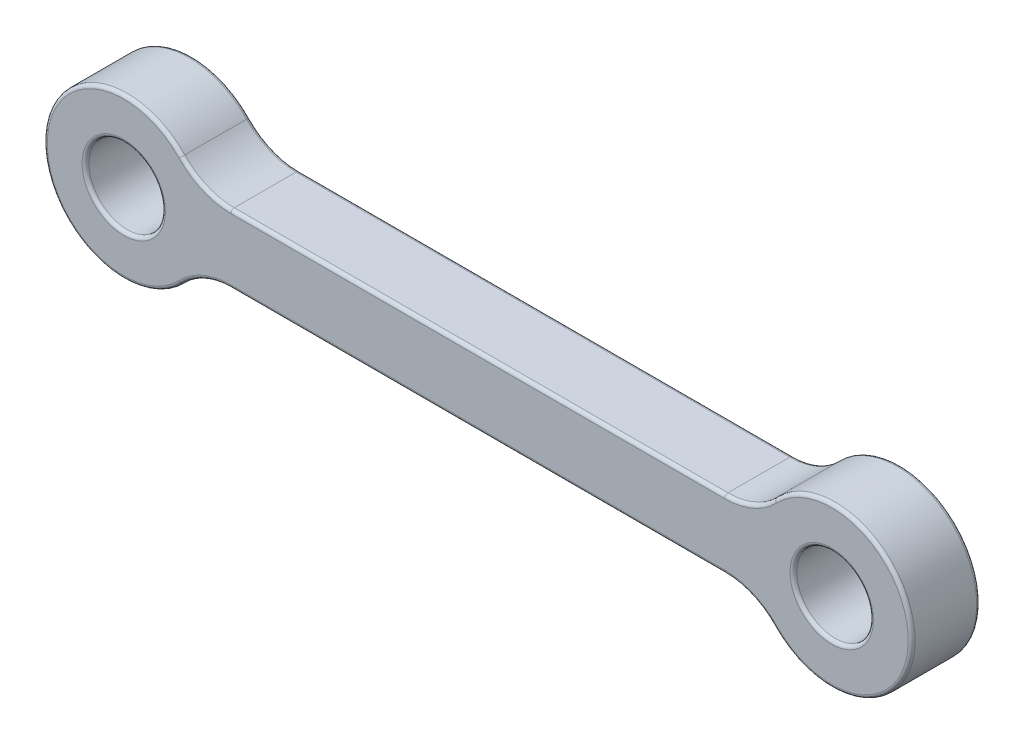
ISO-10303-21;
HEADER;
FILE_DESCRIPTION(('STEP AP214'),'2;1');
FILE_NAME('part.step','',(''),(''),'','','');
FILE_SCHEMA(('AUTOMOTIVE_DESIGN { 1 0 10303 214 1 1 1 1 }'));
ENDSEC;
DATA;
#1=APPLICATION_CONTEXT('core data for automotive mechanical design processes');
#2=APPLICATION_PROTOCOL_DEFINITION('international standard','automotive_design',2000,#1);
#3=PRODUCT_CONTEXT('',#1,'mechanical');
#4=PRODUCT('Part','Part','',(#3));
#5=PRODUCT_RELATED_PRODUCT_CATEGORY('part','',(#4));
#6=PRODUCT_DEFINITION_FORMATION('','',#4);
#7=PRODUCT_DEFINITION_CONTEXT('part definition',#1,'design');
#8=PRODUCT_DEFINITION('design','',#6,#7);
#9=PRODUCT_DEFINITION_SHAPE('','',#8);
#10=(LENGTH_UNIT() NAMED_UNIT(*) SI_UNIT(.MILLI.,.METRE.));
#11=(NAMED_UNIT(*) PLANE_ANGLE_UNIT() SI_UNIT($,.RADIAN.));
#12=(NAMED_UNIT(*) SI_UNIT($,.STERADIAN.) SOLID_ANGLE_UNIT());
#13=UNCERTAINTY_MEASURE_WITH_UNIT(LENGTH_MEASURE(1.E-05),#10,'distance_accuracy_value','');
#14=(GEOMETRIC_REPRESENTATION_CONTEXT(3) GLOBAL_UNCERTAINTY_ASSIGNED_CONTEXT((#13)) GLOBAL_UNIT_ASSIGNED_CONTEXT((#10,
#11,#12)) REPRESENTATION_CONTEXT('',''));
#15=CARTESIAN_POINT('',(0.,0.,0.));
#16=DIRECTION('',(0.,0.,1.));
#17=DIRECTION('',(1.,0.,0.));
#18=AXIS2_PLACEMENT_3D('',#15,#16,#17);
#19=CARTESIAN_POINT('',(0.,1.5,1.5));
#20=DIRECTION('',(0.,-1.,0.));
#21=DIRECTION('',(0.,0.,-1.));
#22=AXIS2_PLACEMENT_3D('',#19,#20,#21);
#23=PLANE('',#22);
#24=DIRECTION('',(0.,0.,-1.));
#25=VECTOR('',#24,1.);
#26=CARTESIAN_POINT('',(26.3095842401766,1.5,1.5));
#27=LINE('',#26,#25);
#28=CARTESIAN_POINT('',(26.3095842401766,1.5,1.35));
#29=VERTEX_POINT('',#28);
#30=CARTESIAN_POINT('',(26.3095842401766,1.5,-1.35));
#31=VERTEX_POINT('',#30);
#32=EDGE_CURVE('E310',#29,#31,#27,.T.);
#33=ORIENTED_EDGE('',*,*,#32,.T.);
#34=DIRECTION('',(-1.,0.,0.));
#35=VECTOR('',#34,1.);
#36=CARTESIAN_POINT('',(0.,1.5,-1.35));
#37=LINE('',#36,#35);
#38=CARTESIAN_POINT('',(4.69041575982343,1.5,-1.35));
#39=VERTEX_POINT('',#38);
#40=EDGE_CURVE('E231',#31,#39,#37,.T.);
#41=ORIENTED_EDGE('',*,*,#40,.T.);
#42=DIRECTION('',(0.,0.,1.));
#43=VECTOR('',#42,1.);
#44=CARTESIAN_POINT('',(4.69041575982343,1.5,1.5));
#45=LINE('',#44,#43);
#46=CARTESIAN_POINT('',(4.69041575982343,1.5,1.35));
#47=VERTEX_POINT('',#46);
#48=EDGE_CURVE('E303',#39,#47,#45,.T.);
#49=ORIENTED_EDGE('',*,*,#48,.T.);
#50=DIRECTION('',(-1.,0.,0.));
#51=VECTOR('',#50,1.);
#52=CARTESIAN_POINT('',(26.3095842401766,1.5,1.35));
#53=LINE('',#52,#51);
#54=EDGE_CURVE('E229',#47,#29,#53,.F.);
#55=ORIENTED_EDGE('',*,*,#54,.T.);
#56=EDGE_LOOP('',(#33,#41,#49,#55));
#57=FACE_BOUND('',#56,.T.);
#58=ADVANCED_FACE('F43',(#57),#23,.F.);
#59=CARTESIAN_POINT('',(0.,0.,1.5));
#60=DIRECTION('',(0.,0.,-1.));
#61=DIRECTION('',(-1.,0.,0.));
#62=AXIS2_PLACEMENT_3D('',#59,#60,#61);
#63=CYLINDRICAL_SURFACE('',#62,3.5);
#64=DIRECTION('',(0.,0.,-1.));
#65=VECTOR('',#64,1.);
#66=CARTESIAN_POINT('',(2.52560848605877,2.42307692307692,1.5));
#67=LINE('',#66,#65);
#68=CARTESIAN_POINT('',(2.52560848605877,2.42307692307692,1.35));
#69=VERTEX_POINT('',#68);
#70=CARTESIAN_POINT('',(2.52560848605877,2.42307692307692,-1.35));
#71=VERTEX_POINT('',#70);
#72=EDGE_CURVE('E305',#69,#71,#67,.T.);
#73=ORIENTED_EDGE('',*,*,#72,.T.);
#74=CARTESIAN_POINT('',(0.,0.,-1.35));
#75=DIRECTION('',(0.,0.,1.));
#76=DIRECTION('',(1.,0.,0.));
#77=AXIS2_PLACEMENT_3D('',#74,#75,#76);
#78=CIRCLE('',#77,3.5);
#79=CARTESIAN_POINT('',(2.52560848605877,-2.42307692307692,-1.35));
#80=VERTEX_POINT('',#79);
#81=EDGE_CURVE('E206',#71,#80,#78,.T.);
#82=ORIENTED_EDGE('',*,*,#81,.T.);
#83=DIRECTION('',(0.,0.,-1.));
#84=VECTOR('',#83,1.);
#85=CARTESIAN_POINT('',(2.52560848605877,-2.42307692307692,1.5));
#86=LINE('',#85,#84);
#87=CARTESIAN_POINT('',(2.52560848605877,-2.42307692307692,1.35));
#88=VERTEX_POINT('',#87);
#89=EDGE_CURVE('E266',#80,#88,#86,.F.);
#90=ORIENTED_EDGE('',*,*,#89,.T.);
#91=CARTESIAN_POINT('',(0.,0.,1.35));
#92=DIRECTION('',(0.,0.,1.));
#93=DIRECTION('',(1.,0.,0.));
#94=AXIS2_PLACEMENT_3D('',#91,#92,#93);
#95=CIRCLE('',#94,3.5);
#96=EDGE_CURVE('E204',#88,#69,#95,.F.);
#97=ORIENTED_EDGE('',*,*,#96,.T.);
#98=EDGE_LOOP('',(#73,#82,#90,#97));
#99=FACE_BOUND('',#98,.T.);
#100=ADVANCED_FACE('F350',(#99),#63,.T.);
#101=CARTESIAN_POINT('',(0.,-1.5,1.5));
#102=DIRECTION('',(0.,-1.,0.));
#103=DIRECTION('',(0.,0.,-1.));
#104=AXIS2_PLACEMENT_3D('',#101,#102,#103);
#105=PLANE('',#104);
#106=DIRECTION('',(0.,0.,-1.));
#107=VECTOR('',#106,1.);
#108=CARTESIAN_POINT('',(4.69041575982343,-1.5,1.5));
#109=LINE('',#108,#107);
#110=CARTESIAN_POINT('',(4.69041575982343,-1.5,1.35));
#111=VERTEX_POINT('',#110);
#112=CARTESIAN_POINT('',(4.69041575982343,-1.5,-1.35));
#113=VERTEX_POINT('',#112);
#114=EDGE_CURVE('E323',#111,#113,#109,.T.);
#115=ORIENTED_EDGE('',*,*,#114,.T.);
#116=DIRECTION('',(-1.,0.,0.));
#117=VECTOR('',#116,1.);
#118=CARTESIAN_POINT('',(26.3095842401766,-1.5,-1.35));
#119=LINE('',#118,#117);
#120=CARTESIAN_POINT('',(26.3095842401766,-1.5,-1.35));
#121=VERTEX_POINT('',#120);
#122=EDGE_CURVE('E214',#113,#121,#119,.F.);
#123=ORIENTED_EDGE('',*,*,#122,.T.);
#124=DIRECTION('',(0.,0.,1.));
#125=VECTOR('',#124,1.);
#126=CARTESIAN_POINT('',(26.3095842401766,-1.5,1.5));
#127=LINE('',#126,#125);
#128=CARTESIAN_POINT('',(26.3095842401766,-1.5,1.35));
#129=VERTEX_POINT('',#128);
#130=EDGE_CURVE('E320',#121,#129,#127,.T.);
#131=ORIENTED_EDGE('',*,*,#130,.T.);
#132=DIRECTION('',(-1.,0.,0.));
#133=VECTOR('',#132,1.);
#134=CARTESIAN_POINT('',(0.,-1.5,1.35));
#135=LINE('',#134,#133);
#136=EDGE_CURVE('E212',#129,#111,#135,.T.);
#137=ORIENTED_EDGE('',*,*,#136,.T.);
#138=EDGE_LOOP('',(#115,#123,#131,#137));
#139=FACE_BOUND('',#138,.T.);
#140=ADVANCED_FACE('F395',(#139),#105,.T.);
#141=CARTESIAN_POINT('',(0.,0.,1.5));
#142=DIRECTION('',(0.,0.,-1.));
#143=DIRECTION('',(-1.,0.,0.));
#144=AXIS2_PLACEMENT_3D('',#141,#142,#143);
#145=CYLINDRICAL_SURFACE('',#144,1.675);
#146=CARTESIAN_POINT('',(0.,0.,-1.35));
#147=DIRECTION('',(0.,0.,1.));
#148=DIRECTION('',(1.,0.,0.));
#149=AXIS2_PLACEMENT_3D('',#146,#147,#148);
#150=CIRCLE('',#149,1.675);
#151=CARTESIAN_POINT('',(1.675,0.,-1.35));
#152=VERTEX_POINT('',#151);
#153=EDGE_CURVE('E198',#152,#152,#150,.F.);
#154=ORIENTED_EDGE('',*,*,#153,.T.);
#155=EDGE_LOOP('',(#154));
#156=FACE_BOUND('',#155,.T.);
#157=CARTESIAN_POINT('',(0.,0.,1.35));
#158=DIRECTION('',(0.,0.,1.));
#159=DIRECTION('',(1.,0.,0.));
#160=AXIS2_PLACEMENT_3D('',#157,#158,#159);
#161=CIRCLE('',#160,1.675);
#162=CARTESIAN_POINT('',(1.675,0.,1.35));
#163=VERTEX_POINT('',#162);
#164=EDGE_CURVE('E195',#163,#163,#161,.T.);
#165=ORIENTED_EDGE('',*,*,#164,.T.);
#166=EDGE_LOOP('',(#165));
#167=FACE_BOUND('',#166,.T.);
#168=ADVANCED_FACE('F397',(#156,#167),#145,.F.);
#169=CARTESIAN_POINT('',(31.,0.,1.5));
#170=DIRECTION('',(0.,0.,-1.));
#171=DIRECTION('',(-1.,0.,0.));
#172=AXIS2_PLACEMENT_3D('',#169,#170,#171);
#173=CYLINDRICAL_SURFACE('',#172,3.5);
#174=DIRECTION('',(0.,0.,-1.));
#175=VECTOR('',#174,1.);
#176=CARTESIAN_POINT('',(28.4743915139412,-2.42307692307692,1.5));
#177=LINE('',#176,#175);
#178=CARTESIAN_POINT('',(28.4743915139412,-2.42307692307692,1.35));
#179=VERTEX_POINT('',#178);
#180=CARTESIAN_POINT('',(28.4743915139412,-2.42307692307692,-1.35));
#181=VERTEX_POINT('',#180);
#182=EDGE_CURVE('E309',#179,#181,#177,.T.);
#183=ORIENTED_EDGE('',*,*,#182,.T.);
#184=CARTESIAN_POINT('',(31.,0.,-1.35));
#185=DIRECTION('',(0.,0.,1.));
#186=DIRECTION('',(1.,0.,0.));
#187=AXIS2_PLACEMENT_3D('',#184,#185,#186);
#188=CIRCLE('',#187,3.5);
#189=CARTESIAN_POINT('',(28.4743915139412,2.42307692307692,-1.35));
#190=VERTEX_POINT('',#189);
#191=EDGE_CURVE('E223',#181,#190,#188,.T.);
#192=ORIENTED_EDGE('',*,*,#191,.T.);
#193=DIRECTION('',(0.,0.,-1.));
#194=VECTOR('',#193,1.);
#195=CARTESIAN_POINT('',(28.4743915139412,2.42307692307692,1.5));
#196=LINE('',#195,#194);
#197=CARTESIAN_POINT('',(28.4743915139412,2.42307692307692,1.35));
#198=VERTEX_POINT('',#197);
#199=EDGE_CURVE('E313',#190,#198,#196,.F.);
#200=ORIENTED_EDGE('',*,*,#199,.T.);
#201=CARTESIAN_POINT('',(31.,0.,1.35));
#202=DIRECTION('',(0.,0.,1.));
#203=DIRECTION('',(1.,0.,0.));
#204=AXIS2_PLACEMENT_3D('',#201,#202,#203);
#205=CIRCLE('',#204,3.5);
#206=EDGE_CURVE('E221',#198,#179,#205,.F.);
#207=ORIENTED_EDGE('',*,*,#206,.T.);
#208=EDGE_LOOP('',(#183,#192,#200,#207));
#209=FACE_BOUND('',#208,.T.);
#210=ADVANCED_FACE('F379',(#209),#173,.T.);
#211=CARTESIAN_POINT('',(31.,0.,1.5));
#212=DIRECTION('',(0.,0.,-1.));
#213=DIRECTION('',(-1.,0.,0.));
#214=AXIS2_PLACEMENT_3D('',#211,#212,#213);
#215=CYLINDRICAL_SURFACE('',#214,1.675);
#216=CARTESIAN_POINT('',(31.,0.,-1.35));
#217=DIRECTION('',(0.,0.,1.));
#218=DIRECTION('',(1.,0.,0.));
#219=AXIS2_PLACEMENT_3D('',#216,#217,#218);
#220=CIRCLE('',#219,1.675);
#221=CARTESIAN_POINT('',(32.675,0.,-1.35));
#222=VERTEX_POINT('',#221);
#223=EDGE_CURVE('E178',#222,#222,#220,.F.);
#224=ORIENTED_EDGE('',*,*,#223,.T.);
#225=EDGE_LOOP('',(#224));
#226=FACE_BOUND('',#225,.T.);
#227=CARTESIAN_POINT('',(31.,0.,1.35));
#228=DIRECTION('',(0.,0.,1.));
#229=DIRECTION('',(1.,0.,0.));
#230=AXIS2_PLACEMENT_3D('',#227,#228,#229);
#231=CIRCLE('',#230,1.675);
#232=CARTESIAN_POINT('',(32.675,0.,1.35));
#233=VERTEX_POINT('',#232);
#234=EDGE_CURVE('E326',#233,#233,#231,.T.);
#235=ORIENTED_EDGE('',*,*,#234,.T.);
#236=EDGE_LOOP('',(#235));
#237=FACE_BOUND('',#236,.T.);
#238=ADVANCED_FACE('F571',(#226,#237),#215,.F.);
#239=CARTESIAN_POINT('',(0.,0.,1.5));
#240=DIRECTION('',(0.,0.,1.));
#241=DIRECTION('',(1.,0.,0.));
#242=AXIS2_PLACEMENT_3D('',#239,#240,#241);
#243=PLANE('',#242);
#244=CARTESIAN_POINT('',(31.,0.,1.5));
#245=DIRECTION('',(0.,0.,1.));
#246=DIRECTION('',(1.,0.,0.));
#247=AXIS2_PLACEMENT_3D('',#244,#245,#246);
#248=CIRCLE('',#247,1.825);
#249=CARTESIAN_POINT('',(32.825,0.,1.5));
#250=VERTEX_POINT('',#249);
#251=EDGE_CURVE('E11',#250,#250,#248,.F.);
#252=ORIENTED_EDGE('',*,*,#251,.T.);
#253=EDGE_LOOP('',(#252));
#254=FACE_BOUND('',#253,.T.);
#255=CARTESIAN_POINT('',(0.,0.,1.5));
#256=DIRECTION('',(0.,0.,1.));
#257=DIRECTION('',(1.,0.,0.));
#258=AXIS2_PLACEMENT_3D('',#255,#256,#257);
#259=CIRCLE('',#258,1.825);
#260=CARTESIAN_POINT('',(1.825,0.,1.5));
#261=VERTEX_POINT('',#260);
#262=EDGE_CURVE('E52',#261,#261,#259,.F.);
#263=ORIENTED_EDGE('',*,*,#262,.T.);
#264=EDGE_LOOP('',(#263));
#265=FACE_BOUND('',#264,.T.);
#266=DIRECTION('',(-1.,0.,0.));
#267=VECTOR('',#266,1.);
#268=CARTESIAN_POINT('',(0.,-1.35,1.5));
#269=LINE('',#268,#267);
#270=CARTESIAN_POINT('',(4.69041575982343,-1.35,1.5));
#271=VERTEX_POINT('',#270);
#272=CARTESIAN_POINT('',(26.3095842401766,-1.35,1.5));
#273=VERTEX_POINT('',#272);
#274=EDGE_CURVE('E60',#271,#273,#269,.F.);
#275=ORIENTED_EDGE('',*,*,#274,.T.);
#276=CARTESIAN_POINT('',(26.3095842401766,-4.5,1.5));
#277=DIRECTION('',(0.,0.,1.));
#278=DIRECTION('',(1.,0.,0.));
#279=AXIS2_PLACEMENT_3D('',#276,#277,#278);
#280=CIRCLE('',#279,3.15);
#281=CARTESIAN_POINT('',(28.5826318776295,-2.31923076923077,1.5));
#282=VERTEX_POINT('',#281);
#283=EDGE_CURVE('E245',#273,#282,#280,.F.);
#284=ORIENTED_EDGE('',*,*,#283,.T.);
#285=CARTESIAN_POINT('',(31.,0.,1.5));
#286=DIRECTION('',(0.,0.,1.));
#287=DIRECTION('',(1.,0.,0.));
#288=AXIS2_PLACEMENT_3D('',#285,#286,#287);
#289=CIRCLE('',#288,3.35);
#290=CARTESIAN_POINT('',(28.5826318776295,2.31923076923077,1.5));
#291=VERTEX_POINT('',#290);
#292=EDGE_CURVE('E233',#282,#291,#289,.T.);
#293=ORIENTED_EDGE('',*,*,#292,.T.);
#294=CARTESIAN_POINT('',(26.3095842401766,4.5,1.5));
#295=DIRECTION('',(0.,0.,1.));
#296=DIRECTION('',(1.,0.,0.));
#297=AXIS2_PLACEMENT_3D('',#294,#295,#296);
#298=CIRCLE('',#297,3.15);
#299=CARTESIAN_POINT('',(26.3095842401766,1.35,1.5));
#300=VERTEX_POINT('',#299);
#301=EDGE_CURVE('E235',#291,#300,#298,.F.);
#302=ORIENTED_EDGE('',*,*,#301,.T.);
#303=DIRECTION('',(-1.,0.,0.));
#304=VECTOR('',#303,1.);
#305=CARTESIAN_POINT('',(4.69041575982343,1.35,1.5));
#306=LINE('',#305,#304);
#307=CARTESIAN_POINT('',(4.69041575982343,1.35,1.5));
#308=VERTEX_POINT('',#307);
#309=EDGE_CURVE('E237',#300,#308,#306,.T.);
#310=ORIENTED_EDGE('',*,*,#309,.T.);
#311=CARTESIAN_POINT('',(4.69041575982343,4.5,1.5));
#312=DIRECTION('',(0.,0.,1.));
#313=DIRECTION('',(1.,0.,0.));
#314=AXIS2_PLACEMENT_3D('',#311,#312,#313);
#315=CIRCLE('',#314,3.15);
#316=CARTESIAN_POINT('',(2.41736812237054,2.31923076923077,1.5));
#317=VERTEX_POINT('',#316);
#318=EDGE_CURVE('E239',#308,#317,#315,.F.);
#319=ORIENTED_EDGE('',*,*,#318,.T.);
#320=CARTESIAN_POINT('',(0.,0.,1.5));
#321=DIRECTION('',(0.,0.,1.));
#322=DIRECTION('',(1.,0.,0.));
#323=AXIS2_PLACEMENT_3D('',#320,#321,#322);
#324=CIRCLE('',#323,3.35);
#325=CARTESIAN_POINT('',(2.41736812237054,-2.31923076923077,1.5));
#326=VERTEX_POINT('',#325);
#327=EDGE_CURVE('E241',#317,#326,#324,.T.);
#328=ORIENTED_EDGE('',*,*,#327,.T.);
#329=CARTESIAN_POINT('',(4.69041575982343,-4.5,1.5));
#330=DIRECTION('',(0.,0.,1.));
#331=DIRECTION('',(1.,0.,0.));
#332=AXIS2_PLACEMENT_3D('',#329,#330,#331);
#333=CIRCLE('',#332,3.15);
#334=EDGE_CURVE('E65',#326,#271,#333,.F.);
#335=ORIENTED_EDGE('',*,*,#334,.T.);
#336=EDGE_LOOP('',(#275,#284,#293,#302,#310,#319,#328,#335));
#337=FACE_BOUND('',#336,.T.);
#338=ADVANCED_FACE('F367',(#254,#265,#337),#243,.T.);
#339=CARTESIAN_POINT('',(0.,0.,-1.5));
#340=DIRECTION('',(0.,0.,1.));
#341=DIRECTION('',(1.,0.,0.));
#342=AXIS2_PLACEMENT_3D('',#339,#340,#341);
#343=PLANE('',#342);
#344=CARTESIAN_POINT('',(31.,0.,-1.5));
#345=DIRECTION('',(0.,0.,1.));
#346=DIRECTION('',(1.,0.,0.));
#347=AXIS2_PLACEMENT_3D('',#344,#345,#346);
#348=CIRCLE('',#347,1.825);
#349=CARTESIAN_POINT('',(32.825,0.,-1.5));
#350=VERTEX_POINT('',#349);
#351=EDGE_CURVE('E187',#350,#350,#348,.T.);
#352=ORIENTED_EDGE('',*,*,#351,.T.);
#353=EDGE_LOOP('',(#352));
#354=FACE_BOUND('',#353,.T.);
#355=CARTESIAN_POINT('',(0.,0.,-1.5));
#356=DIRECTION('',(0.,0.,1.));
#357=DIRECTION('',(1.,0.,0.));
#358=AXIS2_PLACEMENT_3D('',#355,#356,#357);
#359=CIRCLE('',#358,1.825);
#360=CARTESIAN_POINT('',(1.825,0.,-1.5));
#361=VERTEX_POINT('',#360);
#362=EDGE_CURVE('E184',#361,#361,#359,.T.);
#363=ORIENTED_EDGE('',*,*,#362,.T.);
#364=EDGE_LOOP('',(#363));
#365=FACE_BOUND('',#364,.T.);
#366=CARTESIAN_POINT('',(0.,0.,-1.5));
#367=DIRECTION('',(0.,0.,1.));
#368=DIRECTION('',(1.,0.,0.));
#369=AXIS2_PLACEMENT_3D('',#366,#367,#368);
#370=CIRCLE('',#369,3.35);
#371=CARTESIAN_POINT('',(2.41736812237054,-2.31923076923077,-1.5));
#372=VERTEX_POINT('',#371);
#373=CARTESIAN_POINT('',(2.41736812237054,2.31923076923077,-1.5));
#374=VERTEX_POINT('',#373);
#375=EDGE_CURVE('E182',#372,#374,#370,.F.);
#376=ORIENTED_EDGE('',*,*,#375,.T.);
#377=CARTESIAN_POINT('',(4.69041575982343,4.5,-1.5));
#378=DIRECTION('',(0.,0.,1.));
#379=DIRECTION('',(1.,0.,0.));
#380=AXIS2_PLACEMENT_3D('',#377,#378,#379);
#381=CIRCLE('',#380,3.15);
#382=CARTESIAN_POINT('',(4.69041575982343,1.35,-1.5));
#383=VERTEX_POINT('',#382);
#384=EDGE_CURVE('E163',#374,#383,#381,.T.);
#385=ORIENTED_EDGE('',*,*,#384,.T.);
#386=DIRECTION('',(-1.,0.,0.));
#387=VECTOR('',#386,1.);
#388=CARTESIAN_POINT('',(0.,1.35,-1.5));
#389=LINE('',#388,#387);
#390=CARTESIAN_POINT('',(26.3095842401766,1.35,-1.5));
#391=VERTEX_POINT('',#390);
#392=EDGE_CURVE('E171',#383,#391,#389,.F.);
#393=ORIENTED_EDGE('',*,*,#392,.T.);
#394=CARTESIAN_POINT('',(26.3095842401766,4.5,-1.5));
#395=DIRECTION('',(0.,0.,1.));
#396=DIRECTION('',(1.,0.,0.));
#397=AXIS2_PLACEMENT_3D('',#394,#395,#396);
#398=CIRCLE('',#397,3.15);
#399=CARTESIAN_POINT('',(28.5826318776295,2.31923076923077,-1.5));
#400=VERTEX_POINT('',#399);
#401=EDGE_CURVE('E177',#391,#400,#398,.T.);
#402=ORIENTED_EDGE('',*,*,#401,.T.);
#403=CARTESIAN_POINT('',(31.,0.,-1.5));
#404=DIRECTION('',(0.,0.,1.));
#405=DIRECTION('',(1.,0.,0.));
#406=AXIS2_PLACEMENT_3D('',#403,#404,#405);
#407=CIRCLE('',#406,3.35);
#408=CARTESIAN_POINT('',(28.5826318776295,-2.31923076923077,-1.5));
#409=VERTEX_POINT('',#408);
#410=EDGE_CURVE('E332',#400,#409,#407,.F.);
#411=ORIENTED_EDGE('',*,*,#410,.T.);
#412=CARTESIAN_POINT('',(26.3095842401766,-4.5,-1.5));
#413=DIRECTION('',(0.,0.,1.));
#414=DIRECTION('',(1.,0.,0.));
#415=AXIS2_PLACEMENT_3D('',#412,#413,#414);
#416=CIRCLE('',#415,3.15);
#417=CARTESIAN_POINT('',(26.3095842401766,-1.35,-1.5));
#418=VERTEX_POINT('',#417);
#419=EDGE_CURVE('E334',#409,#418,#416,.T.);
#420=ORIENTED_EDGE('',*,*,#419,.T.);
#421=DIRECTION('',(-1.,0.,0.));
#422=VECTOR('',#421,1.);
#423=CARTESIAN_POINT('',(4.69041575982343,-1.35,-1.5));
#424=LINE('',#423,#422);
#425=CARTESIAN_POINT('',(4.69041575982343,-1.35,-1.5));
#426=VERTEX_POINT('',#425);
#427=EDGE_CURVE('E336',#418,#426,#424,.T.);
#428=ORIENTED_EDGE('',*,*,#427,.T.);
#429=CARTESIAN_POINT('',(4.69041575982343,-4.5,-1.5));
#430=DIRECTION('',(0.,0.,1.));
#431=DIRECTION('',(1.,0.,0.));
#432=AXIS2_PLACEMENT_3D('',#429,#430,#431);
#433=CIRCLE('',#432,3.15);
#434=EDGE_CURVE('E189',#426,#372,#433,.T.);
#435=ORIENTED_EDGE('',*,*,#434,.T.);
#436=EDGE_LOOP('',(#376,#385,#393,#402,#411,#420,#428,#435));
#437=FACE_BOUND('',#436,.T.);
#438=ADVANCED_FACE('F180',(#354,#365,#437),#343,.F.);
#439=CARTESIAN_POINT('',(4.69041575982343,4.5,1.5));
#440=DIRECTION('',(0.,0.,-1.));
#441=DIRECTION('',(-1.,0.,0.));
#442=AXIS2_PLACEMENT_3D('',#439,#440,#441);
#443=CYLINDRICAL_SURFACE('',#442,3.);
#444=ORIENTED_EDGE('',*,*,#48,.F.);
#445=CARTESIAN_POINT('',(4.69041575982343,4.5,-1.35));
#446=DIRECTION('',(0.,0.,1.));
#447=DIRECTION('',(1.,0.,0.));
#448=AXIS2_PLACEMENT_3D('',#445,#446,#447);
#449=CIRCLE('',#448,3.);
#450=EDGE_CURVE('E165',#39,#71,#449,.F.);
#451=ORIENTED_EDGE('',*,*,#450,.T.);
#452=ORIENTED_EDGE('',*,*,#72,.F.);
#453=CARTESIAN_POINT('',(4.69041575982343,4.5,1.35));
#454=DIRECTION('',(0.,0.,1.));
#455=DIRECTION('',(1.,0.,0.));
#456=AXIS2_PLACEMENT_3D('',#453,#454,#455);
#457=CIRCLE('',#456,3.);
#458=EDGE_CURVE('E201',#69,#47,#457,.T.);
#459=ORIENTED_EDGE('',*,*,#458,.T.);
#460=EDGE_LOOP('',(#444,#451,#452,#459));
#461=FACE_BOUND('',#460,.T.);
#462=ADVANCED_FACE('F302',(#461),#443,.F.);
#463=CARTESIAN_POINT('',(26.3095842401766,4.5,1.5));
#464=DIRECTION('',(0.,0.,-1.));
#465=DIRECTION('',(-1.,0.,0.));
#466=AXIS2_PLACEMENT_3D('',#463,#464,#465);
#467=CYLINDRICAL_SURFACE('',#466,3.);
#468=ORIENTED_EDGE('',*,*,#199,.F.);
#469=CARTESIAN_POINT('',(26.3095842401766,4.5,-1.35));
#470=DIRECTION('',(0.,0.,1.));
#471=DIRECTION('',(1.,0.,0.));
#472=AXIS2_PLACEMENT_3D('',#469,#470,#471);
#473=CIRCLE('',#472,3.);
#474=EDGE_CURVE('E227',#190,#31,#473,.F.);
#475=ORIENTED_EDGE('',*,*,#474,.T.);
#476=ORIENTED_EDGE('',*,*,#32,.F.);
#477=CARTESIAN_POINT('',(26.3095842401766,4.5,1.35));
#478=DIRECTION('',(0.,0.,1.));
#479=DIRECTION('',(1.,0.,0.));
#480=AXIS2_PLACEMENT_3D('',#477,#478,#479);
#481=CIRCLE('',#480,3.);
#482=EDGE_CURVE('E225',#29,#198,#481,.T.);
#483=ORIENTED_EDGE('',*,*,#482,.T.);
#484=EDGE_LOOP('',(#468,#475,#476,#483));
#485=FACE_BOUND('',#484,.T.);
#486=ADVANCED_FACE('F414',(#485),#467,.F.);
#487=CARTESIAN_POINT('',(4.69041575982343,-4.5,1.5));
#488=DIRECTION('',(0.,0.,-1.));
#489=DIRECTION('',(-1.,0.,0.));
#490=AXIS2_PLACEMENT_3D('',#487,#488,#489);
#491=CYLINDRICAL_SURFACE('',#490,3.);
#492=ORIENTED_EDGE('',*,*,#89,.F.);
#493=CARTESIAN_POINT('',(4.69041575982343,-4.5,-1.35));
#494=DIRECTION('',(0.,0.,1.));
#495=DIRECTION('',(1.,0.,0.));
#496=AXIS2_PLACEMENT_3D('',#493,#494,#495);
#497=CIRCLE('',#496,3.);
#498=EDGE_CURVE('E210',#80,#113,#497,.F.);
#499=ORIENTED_EDGE('',*,*,#498,.T.);
#500=ORIENTED_EDGE('',*,*,#114,.F.);
#501=CARTESIAN_POINT('',(4.69041575982343,-4.5,1.35));
#502=DIRECTION('',(0.,0.,1.));
#503=DIRECTION('',(1.,0.,0.));
#504=AXIS2_PLACEMENT_3D('',#501,#502,#503);
#505=CIRCLE('',#504,3.);
#506=EDGE_CURVE('E208',#111,#88,#505,.T.);
#507=ORIENTED_EDGE('',*,*,#506,.T.);
#508=EDGE_LOOP('',(#492,#499,#500,#507));
#509=FACE_BOUND('',#508,.T.);
#510=ADVANCED_FACE('F353',(#509),#491,.F.);
#511=CARTESIAN_POINT('',(26.3095842401766,-4.5,1.5));
#512=DIRECTION('',(0.,0.,-1.));
#513=DIRECTION('',(-1.,0.,0.));
#514=AXIS2_PLACEMENT_3D('',#511,#512,#513);
#515=CYLINDRICAL_SURFACE('',#514,3.);
#516=ORIENTED_EDGE('',*,*,#130,.F.);
#517=CARTESIAN_POINT('',(26.3095842401766,-4.5,-1.35));
#518=DIRECTION('',(0.,0.,1.));
#519=DIRECTION('',(1.,0.,0.));
#520=AXIS2_PLACEMENT_3D('',#517,#518,#519);
#521=CIRCLE('',#520,3.);
#522=EDGE_CURVE('E219',#121,#181,#521,.F.);
#523=ORIENTED_EDGE('',*,*,#522,.T.);
#524=ORIENTED_EDGE('',*,*,#182,.F.);
#525=CARTESIAN_POINT('',(26.3095842401766,-4.5,1.35));
#526=DIRECTION('',(0.,0.,1.));
#527=DIRECTION('',(1.,0.,0.));
#528=AXIS2_PLACEMENT_3D('',#525,#526,#527);
#529=CIRCLE('',#528,3.);
#530=EDGE_CURVE('E216',#179,#129,#529,.T.);
#531=ORIENTED_EDGE('',*,*,#530,.T.);
#532=EDGE_LOOP('',(#516,#523,#524,#531));
#533=FACE_BOUND('',#532,.T.);
#534=ADVANCED_FACE('F384',(#533),#515,.F.);
#535=CARTESIAN_POINT('',(31.,0.,-1.35));
#536=DIRECTION('',(0.,0.,1.));
#537=DIRECTION('',(1.,0.,0.));
#538=AXIS2_PLACEMENT_3D('',#535,#536,#537);
#539=TOROIDAL_SURFACE('',#538,1.825,0.15);
#540=ORIENTED_EDGE('',*,*,#351,.F.);
#541=EDGE_LOOP('',(#540));
#542=FACE_BOUND('',#541,.T.);
#543=ORIENTED_EDGE('',*,*,#223,.F.);
#544=EDGE_LOOP('',(#543));
#545=FACE_BOUND('',#544,.T.);
#546=ADVANCED_FACE('F422',(#542,#545),#539,.T.);
#547=CARTESIAN_POINT('',(0.,0.,-1.35));
#548=DIRECTION('',(0.,0.,1.));
#549=DIRECTION('',(1.,0.,0.));
#550=AXIS2_PLACEMENT_3D('',#547,#548,#549);
#551=TOROIDAL_SURFACE('',#550,1.825,0.15);
#552=ORIENTED_EDGE('',*,*,#153,.F.);
#553=EDGE_LOOP('',(#552));
#554=FACE_BOUND('',#553,.T.);
#555=ORIENTED_EDGE('',*,*,#362,.F.);
#556=EDGE_LOOP('',(#555));
#557=FACE_BOUND('',#556,.T.);
#558=ADVANCED_FACE('F425',(#554,#557),#551,.T.);
#559=CARTESIAN_POINT('',(26.3095842401766,-4.5,-1.35));
#560=DIRECTION('',(0.,0.,1.));
#561=DIRECTION('',(1.,0.,0.));
#562=AXIS2_PLACEMENT_3D('',#559,#560,#561);
#563=TOROIDAL_SURFACE('',#562,3.15,0.15);
#564=CARTESIAN_POINT('',(28.5826318776295,-2.31923076923077,-1.35));
#565=DIRECTION('',(0.692307692307697,-0.721602424588216,0.));
#566=DIRECTION('',(0.721602424588216,0.692307692307697,0.));
#567=AXIS2_PLACEMENT_3D('',#564,#565,#566);
#568=CIRCLE('',#567,0.15);
#569=EDGE_CURVE('E260',#181,#409,#568,.T.);
#570=ORIENTED_EDGE('',*,*,#569,.F.);
#571=ORIENTED_EDGE('',*,*,#522,.F.);
#572=CARTESIAN_POINT('',(26.3095842401766,-1.35,-1.35));
#573=DIRECTION('',(-1.,0.,0.));
#574=DIRECTION('',(0.,0.,1.));
#575=AXIS2_PLACEMENT_3D('',#572,#573,#574);
#576=CIRCLE('',#575,0.15);
#577=EDGE_CURVE('E263',#418,#121,#576,.T.);
#578=ORIENTED_EDGE('',*,*,#577,.F.);
#579=ORIENTED_EDGE('',*,*,#419,.F.);
#580=EDGE_LOOP('',(#570,#571,#578,#579));
#581=FACE_BOUND('',#580,.T.);
#582=ADVANCED_FACE('F388',(#581),#563,.T.);
#583=CARTESIAN_POINT('',(0.,-1.35,-1.35));
#584=DIRECTION('',(1.,0.,0.));
#585=DIRECTION('',(0.,0.,-1.));
#586=AXIS2_PLACEMENT_3D('',#583,#584,#585);
#587=CYLINDRICAL_SURFACE('',#586,0.15);
#588=ORIENTED_EDGE('',*,*,#577,.T.);
#589=ORIENTED_EDGE('',*,*,#122,.F.);
#590=CARTESIAN_POINT('',(4.69041575982343,-1.35,-1.35));
#591=DIRECTION('',(-1.,0.,0.));
#592=DIRECTION('',(0.,0.,1.));
#593=AXIS2_PLACEMENT_3D('',#590,#591,#592);
#594=CIRCLE('',#593,0.15);
#595=EDGE_CURVE('E257',#426,#113,#594,.T.);
#596=ORIENTED_EDGE('',*,*,#595,.F.);
#597=ORIENTED_EDGE('',*,*,#427,.F.);
#598=EDGE_LOOP('',(#588,#589,#596,#597));
#599=FACE_BOUND('',#598,.T.);
#600=ADVANCED_FACE('F393',(#599),#587,.T.);
#601=CARTESIAN_POINT('',(31.,0.,-1.35));
#602=DIRECTION('',(0.,0.,1.));
#603=DIRECTION('',(1.,0.,0.));
#604=AXIS2_PLACEMENT_3D('',#601,#602,#603);
#605=TOROIDAL_SURFACE('',#604,3.35,0.15);
#606=ORIENTED_EDGE('',*,*,#569,.T.);
#607=ORIENTED_EDGE('',*,*,#410,.F.);
#608=CARTESIAN_POINT('',(28.5826318776295,2.31923076923077,-1.35));
#609=DIRECTION('',(-0.692307692307698,-0.721602424588214,0.));
#610=DIRECTION('',(0.721602424588214,-0.692307692307698,0.));
#611=AXIS2_PLACEMENT_3D('',#608,#609,#610);
#612=CIRCLE('',#611,0.15);
#613=EDGE_CURVE('E254',#190,#400,#612,.T.);
#614=ORIENTED_EDGE('',*,*,#613,.F.);
#615=ORIENTED_EDGE('',*,*,#191,.F.);
#616=EDGE_LOOP('',(#606,#607,#614,#615));
#617=FACE_BOUND('',#616,.T.);
#618=ADVANCED_FACE('F443',(#617),#605,.T.);
#619=CARTESIAN_POINT('',(4.69041575982343,-4.5,-1.35));
#620=DIRECTION('',(0.,0.,1.));
#621=DIRECTION('',(1.,0.,0.));
#622=AXIS2_PLACEMENT_3D('',#619,#620,#621);
#623=TOROIDAL_SURFACE('',#622,3.15,0.15);
#624=ORIENTED_EDGE('',*,*,#595,.T.);
#625=ORIENTED_EDGE('',*,*,#498,.F.);
#626=CARTESIAN_POINT('',(2.41736812237054,-2.31923076923077,-1.35));
#627=DIRECTION('',(-0.692307692307693,-0.72160242458822,0.));
#628=DIRECTION('',(0.72160242458822,-0.692307692307693,0.));
#629=AXIS2_PLACEMENT_3D('',#626,#627,#628);
#630=CIRCLE('',#629,0.15);
#631=EDGE_CURVE('E251',#372,#80,#630,.T.);
#632=ORIENTED_EDGE('',*,*,#631,.F.);
#633=ORIENTED_EDGE('',*,*,#434,.F.);
#634=EDGE_LOOP('',(#624,#625,#632,#633));
#635=FACE_BOUND('',#634,.T.);
#636=ADVANCED_FACE('F343',(#635),#623,.T.);
#637=CARTESIAN_POINT('',(26.3095842401766,4.5,-1.35));
#638=DIRECTION('',(0.,0.,1.));
#639=DIRECTION('',(1.,0.,0.));
#640=AXIS2_PLACEMENT_3D('',#637,#638,#639);
#641=TOROIDAL_SURFACE('',#640,3.15,0.15);
#642=ORIENTED_EDGE('',*,*,#613,.T.);
#643=ORIENTED_EDGE('',*,*,#401,.F.);
#644=CARTESIAN_POINT('',(26.3095842401766,1.35,-1.35));
#645=DIRECTION('',(-1.,0.,0.));
#646=DIRECTION('',(0.,0.,1.));
#647=AXIS2_PLACEMENT_3D('',#644,#645,#646);
#648=CIRCLE('',#647,0.15);
#649=EDGE_CURVE('E174',#31,#391,#648,.T.);
#650=ORIENTED_EDGE('',*,*,#649,.F.);
#651=ORIENTED_EDGE('',*,*,#474,.F.);
#652=EDGE_LOOP('',(#642,#643,#650,#651));
#653=FACE_BOUND('',#652,.T.);
#654=ADVANCED_FACE('F437',(#653),#641,.T.);
#655=CARTESIAN_POINT('',(0.,0.,-1.35));
#656=DIRECTION('',(0.,0.,1.));
#657=DIRECTION('',(1.,0.,0.));
#658=AXIS2_PLACEMENT_3D('',#655,#656,#657);
#659=TOROIDAL_SURFACE('',#658,3.35,0.15);
#660=ORIENTED_EDGE('',*,*,#631,.T.);
#661=ORIENTED_EDGE('',*,*,#81,.F.);
#662=CARTESIAN_POINT('',(2.41736812237054,2.31923076923077,-1.35));
#663=DIRECTION('',(0.692307692307693,-0.72160242458822,0.));
#664=DIRECTION('',(0.72160242458822,0.692307692307693,0.));
#665=AXIS2_PLACEMENT_3D('',#662,#663,#664);
#666=CIRCLE('',#665,0.15);
#667=EDGE_CURVE('E168',#374,#71,#666,.T.);
#668=ORIENTED_EDGE('',*,*,#667,.F.);
#669=ORIENTED_EDGE('',*,*,#375,.F.);
#670=EDGE_LOOP('',(#660,#661,#668,#669));
#671=FACE_BOUND('',#670,.T.);
#672=ADVANCED_FACE('F346',(#671),#659,.T.);
#673=CARTESIAN_POINT('',(0.,1.35,-1.35));
#674=DIRECTION('',(-1.,0.,0.));
#675=DIRECTION('',(0.,0.,1.));
#676=AXIS2_PLACEMENT_3D('',#673,#674,#675);
#677=CYLINDRICAL_SURFACE('',#676,0.15);
#678=ORIENTED_EDGE('',*,*,#649,.T.);
#679=ORIENTED_EDGE('',*,*,#392,.F.);
#680=CARTESIAN_POINT('',(4.69041575982343,1.35,-1.35));
#681=DIRECTION('',(-1.,0.,0.));
#682=DIRECTION('',(0.,0.,1.));
#683=AXIS2_PLACEMENT_3D('',#680,#681,#682);
#684=CIRCLE('',#683,0.15);
#685=EDGE_CURVE('E159',#39,#383,#684,.T.);
#686=ORIENTED_EDGE('',*,*,#685,.F.);
#687=ORIENTED_EDGE('',*,*,#40,.F.);
#688=EDGE_LOOP('',(#678,#679,#686,#687));
#689=FACE_BOUND('',#688,.T.);
#690=ADVANCED_FACE('F172',(#689),#677,.T.);
#691=CARTESIAN_POINT('',(4.69041575982343,4.5,-1.35));
#692=DIRECTION('',(0.,0.,1.));
#693=DIRECTION('',(1.,0.,0.));
#694=AXIS2_PLACEMENT_3D('',#691,#692,#693);
#695=TOROIDAL_SURFACE('',#694,3.15,0.15);
#696=ORIENTED_EDGE('',*,*,#667,.T.);
#697=ORIENTED_EDGE('',*,*,#450,.F.);
#698=ORIENTED_EDGE('',*,*,#685,.T.);
#699=ORIENTED_EDGE('',*,*,#384,.F.);
#700=EDGE_LOOP('',(#696,#697,#698,#699));
#701=FACE_BOUND('',#700,.T.);
#702=ADVANCED_FACE('F161',(#701),#695,.T.);
#703=CARTESIAN_POINT('',(31.,0.,1.35));
#704=DIRECTION('',(0.,0.,1.));
#705=DIRECTION('',(1.,0.,0.));
#706=AXIS2_PLACEMENT_3D('',#703,#704,#705);
#707=TOROIDAL_SURFACE('',#706,1.825,0.15);
#708=ORIENTED_EDGE('',*,*,#234,.F.);
#709=EDGE_LOOP('',(#708));
#710=FACE_BOUND('',#709,.T.);
#711=ORIENTED_EDGE('',*,*,#251,.F.);
#712=EDGE_LOOP('',(#711));
#713=FACE_BOUND('',#712,.T.);
#714=ADVANCED_FACE('F432',(#710,#713),#707,.T.);
#715=CARTESIAN_POINT('',(0.,0.,1.35));
#716=DIRECTION('',(0.,0.,1.));
#717=DIRECTION('',(1.,0.,0.));
#718=AXIS2_PLACEMENT_3D('',#715,#716,#717);
#719=TOROIDAL_SURFACE('',#718,1.825,0.15);
#720=ORIENTED_EDGE('',*,*,#262,.F.);
#721=EDGE_LOOP('',(#720));
#722=FACE_BOUND('',#721,.T.);
#723=ORIENTED_EDGE('',*,*,#164,.F.);
#724=EDGE_LOOP('',(#723));
#725=FACE_BOUND('',#724,.T.);
#726=ADVANCED_FACE('F453',(#722,#725),#719,.T.);
#727=CARTESIAN_POINT('',(4.69041575982343,4.5,1.35));
#728=DIRECTION('',(0.,0.,1.));
#729=DIRECTION('',(1.,0.,0.));
#730=AXIS2_PLACEMENT_3D('',#727,#728,#729);
#731=TOROIDAL_SURFACE('',#730,3.15,0.15);
#732=CARTESIAN_POINT('',(4.69041575982343,1.35,1.35));
#733=DIRECTION('',(1.,0.,0.));
#734=DIRECTION('',(0.,0.,-1.));
#735=AXIS2_PLACEMENT_3D('',#732,#733,#734);
#736=CIRCLE('',#735,0.15);
#737=EDGE_CURVE('E282',#47,#308,#736,.T.);
#738=ORIENTED_EDGE('',*,*,#737,.F.);
#739=ORIENTED_EDGE('',*,*,#458,.F.);
#740=CARTESIAN_POINT('',(2.41736812237054,2.31923076923077,1.35));
#741=DIRECTION('',(-0.692307692307693,0.72160242458822,0.));
#742=DIRECTION('',(-0.72160242458822,-0.692307692307693,0.));
#743=AXIS2_PLACEMENT_3D('',#740,#741,#742);
#744=CIRCLE('',#743,0.15);
#745=EDGE_CURVE('E47',#317,#69,#744,.T.);
#746=ORIENTED_EDGE('',*,*,#745,.F.);
#747=ORIENTED_EDGE('',*,*,#318,.F.);
#748=EDGE_LOOP('',(#738,#739,#746,#747));
#749=FACE_BOUND('',#748,.T.);
#750=ADVANCED_FACE('F45',(#749),#731,.T.);
#751=CARTESIAN_POINT('',(0.,0.,1.35));
#752=DIRECTION('',(0.,0.,1.));
#753=DIRECTION('',(1.,0.,0.));
#754=AXIS2_PLACEMENT_3D('',#751,#752,#753);
#755=TOROIDAL_SURFACE('',#754,3.35,0.15);
#756=ORIENTED_EDGE('',*,*,#745,.T.);
#757=ORIENTED_EDGE('',*,*,#96,.F.);
#758=CARTESIAN_POINT('',(2.41736812237054,-2.31923076923077,1.35));
#759=DIRECTION('',(0.692307692307693,0.72160242458822,0.));
#760=DIRECTION('',(-0.72160242458822,0.692307692307693,0.));
#761=AXIS2_PLACEMENT_3D('',#758,#759,#760);
#762=CIRCLE('',#761,0.15);
#763=EDGE_CURVE('E280',#326,#88,#762,.T.);
#764=ORIENTED_EDGE('',*,*,#763,.F.);
#765=ORIENTED_EDGE('',*,*,#327,.F.);
#766=EDGE_LOOP('',(#756,#757,#764,#765));
#767=FACE_BOUND('',#766,.T.);
#768=ADVANCED_FACE('F293',(#767),#755,.T.);
#769=CARTESIAN_POINT('',(0.,1.35,1.35));
#770=DIRECTION('',(1.,0.,0.));
#771=DIRECTION('',(0.,0.,-1.));
#772=AXIS2_PLACEMENT_3D('',#769,#770,#771);
#773=CYLINDRICAL_SURFACE('',#772,0.15);
#774=ORIENTED_EDGE('',*,*,#737,.T.);
#775=ORIENTED_EDGE('',*,*,#309,.F.);
#776=CARTESIAN_POINT('',(26.3095842401766,1.35,1.35));
#777=DIRECTION('',(1.,0.,0.));
#778=DIRECTION('',(0.,0.,-1.));
#779=AXIS2_PLACEMENT_3D('',#776,#777,#778);
#780=CIRCLE('',#779,0.15);
#781=EDGE_CURVE('E277',#29,#300,#780,.T.);
#782=ORIENTED_EDGE('',*,*,#781,.F.);
#783=ORIENTED_EDGE('',*,*,#54,.F.);
#784=EDGE_LOOP('',(#774,#775,#782,#783));
#785=FACE_BOUND('',#784,.T.);
#786=ADVANCED_FACE('F468',(#785),#773,.T.);
#787=CARTESIAN_POINT('',(4.69041575982343,-4.5,1.35));
#788=DIRECTION('',(0.,0.,1.));
#789=DIRECTION('',(1.,0.,0.));
#790=AXIS2_PLACEMENT_3D('',#787,#788,#789);
#791=TOROIDAL_SURFACE('',#790,3.15,0.15);
#792=ORIENTED_EDGE('',*,*,#763,.T.);
#793=ORIENTED_EDGE('',*,*,#506,.F.);
#794=CARTESIAN_POINT('',(4.69041575982343,-1.35,1.35));
#795=DIRECTION('',(1.,0.,0.));
#796=DIRECTION('',(0.,0.,-1.));
#797=AXIS2_PLACEMENT_3D('',#794,#795,#796);
#798=CIRCLE('',#797,0.15);
#799=EDGE_CURVE('E274',#271,#111,#798,.T.);
#800=ORIENTED_EDGE('',*,*,#799,.F.);
#801=ORIENTED_EDGE('',*,*,#334,.F.);
#802=EDGE_LOOP('',(#792,#793,#800,#801));
#803=FACE_BOUND('',#802,.T.);
#804=ADVANCED_FACE('F357',(#803),#791,.T.);
#805=CARTESIAN_POINT('',(26.3095842401766,4.5,1.35));
#806=DIRECTION('',(0.,0.,1.));
#807=DIRECTION('',(1.,0.,0.));
#808=AXIS2_PLACEMENT_3D('',#805,#806,#807);
#809=TOROIDAL_SURFACE('',#808,3.15,0.15);
#810=ORIENTED_EDGE('',*,*,#781,.T.);
#811=ORIENTED_EDGE('',*,*,#301,.F.);
#812=CARTESIAN_POINT('',(28.5826318776295,2.31923076923077,1.35));
#813=DIRECTION('',(0.692307692307697,0.721602424588216,0.));
#814=DIRECTION('',(-0.721602424588216,0.692307692307697,0.));
#815=AXIS2_PLACEMENT_3D('',#812,#813,#814);
#816=CIRCLE('',#815,0.15);
#817=EDGE_CURVE('E271',#198,#291,#816,.T.);
#818=ORIENTED_EDGE('',*,*,#817,.F.);
#819=ORIENTED_EDGE('',*,*,#482,.F.);
#820=EDGE_LOOP('',(#810,#811,#818,#819));
#821=FACE_BOUND('',#820,.T.);
#822=ADVANCED_FACE('F372',(#821),#809,.T.);
#823=CARTESIAN_POINT('',(0.,-1.35,1.35));
#824=DIRECTION('',(-1.,0.,0.));
#825=DIRECTION('',(0.,0.,1.));
#826=AXIS2_PLACEMENT_3D('',#823,#824,#825);
#827=CYLINDRICAL_SURFACE('',#826,0.15);
#828=ORIENTED_EDGE('',*,*,#799,.T.);
#829=ORIENTED_EDGE('',*,*,#136,.F.);
#830=CARTESIAN_POINT('',(26.3095842401766,-1.35,1.35));
#831=DIRECTION('',(1.,0.,0.));
#832=DIRECTION('',(0.,0.,-1.));
#833=AXIS2_PLACEMENT_3D('',#830,#831,#832);
#834=CIRCLE('',#833,0.15);
#835=EDGE_CURVE('E269',#273,#129,#834,.T.);
#836=ORIENTED_EDGE('',*,*,#835,.F.);
#837=ORIENTED_EDGE('',*,*,#274,.F.);
#838=EDGE_LOOP('',(#828,#829,#836,#837));
#839=FACE_BOUND('',#838,.T.);
#840=ADVANCED_FACE('F360',(#839),#827,.T.);
#841=CARTESIAN_POINT('',(31.,0.,1.35));
#842=DIRECTION('',(0.,0.,1.));
#843=DIRECTION('',(1.,0.,0.));
#844=AXIS2_PLACEMENT_3D('',#841,#842,#843);
#845=TOROIDAL_SURFACE('',#844,3.35,0.15);
#846=ORIENTED_EDGE('',*,*,#817,.T.);
#847=ORIENTED_EDGE('',*,*,#292,.F.);
#848=CARTESIAN_POINT('',(28.5826318776295,-2.31923076923077,1.35));
#849=DIRECTION('',(-0.692307692307698,0.721602424588214,0.));
#850=DIRECTION('',(-0.721602424588214,-0.692307692307698,0.));
#851=AXIS2_PLACEMENT_3D('',#848,#849,#850);
#852=CIRCLE('',#851,0.15);
#853=EDGE_CURVE('E267',#179,#282,#852,.T.);
#854=ORIENTED_EDGE('',*,*,#853,.F.);
#855=ORIENTED_EDGE('',*,*,#206,.F.);
#856=EDGE_LOOP('',(#846,#847,#854,#855));
#857=FACE_BOUND('',#856,.T.);
#858=ADVANCED_FACE('F376',(#857),#845,.T.);
#859=CARTESIAN_POINT('',(26.3095842401766,-4.5,1.35));
#860=DIRECTION('',(0.,0.,1.));
#861=DIRECTION('',(1.,0.,0.));
#862=AXIS2_PLACEMENT_3D('',#859,#860,#861);
#863=TOROIDAL_SURFACE('',#862,3.15,0.15);
#864=ORIENTED_EDGE('',*,*,#835,.T.);
#865=ORIENTED_EDGE('',*,*,#530,.F.);
#866=ORIENTED_EDGE('',*,*,#853,.T.);
#867=ORIENTED_EDGE('',*,*,#283,.F.);
#868=EDGE_LOOP('',(#864,#865,#866,#867));
#869=FACE_BOUND('',#868,.T.);
#870=ADVANCED_FACE('F364',(#869),#863,.T.);
#871=CLOSED_SHELL('',(#58,#100,#140,#168,#210,#238,#338,#438,#462,#486,#510,#534,#546,#558,#582,
#600,#618,#636,#654,#672,#690,#702,#714,#726,#750,#768,#786,#804,#822,#840,#858,#870));
#872=MANIFOLD_SOLID_BREP('B2',#871);
#873=ADVANCED_BREP_SHAPE_REPRESENTATION('',(#18,#872),#14);
#874=SHAPE_DEFINITION_REPRESENTATION(#9,#873);
ENDSEC;
END-ISO-10303-21;
